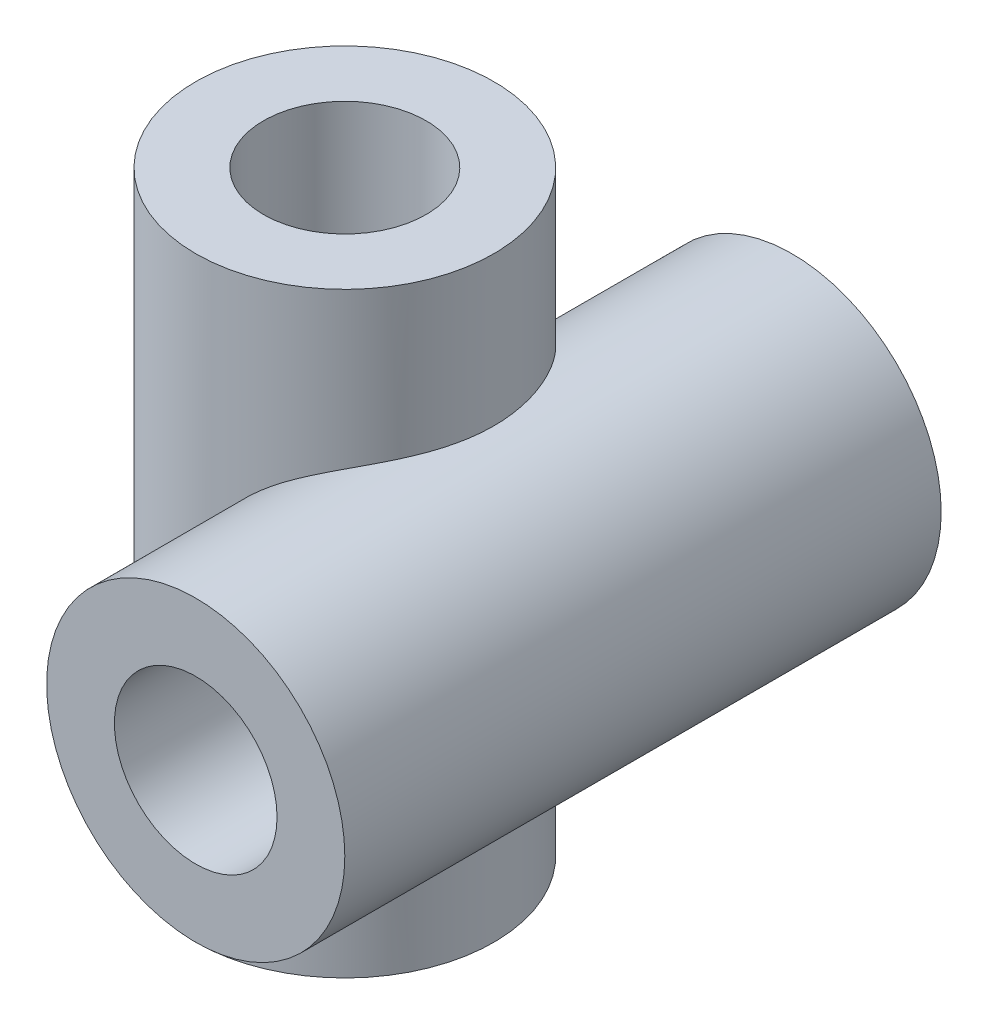
ISO-10303-21;
HEADER;
FILE_DESCRIPTION(('STEP AP214'),'2;1');
FILE_NAME('part.step','',(''),(''),'','','');
FILE_SCHEMA(('AUTOMOTIVE_DESIGN { 1 0 10303 214 1 1 1 1 }'));
ENDSEC;
DATA;
#1=APPLICATION_CONTEXT('core data for automotive mechanical design processes');
#2=APPLICATION_PROTOCOL_DEFINITION('international standard','automotive_design',2000,#1);
#3=PRODUCT_CONTEXT('',#1,'mechanical');
#4=PRODUCT('Part','Part','',(#3));
#5=PRODUCT_RELATED_PRODUCT_CATEGORY('part','',(#4));
#6=PRODUCT_DEFINITION_FORMATION('','',#4);
#7=PRODUCT_DEFINITION_CONTEXT('part definition',#1,'design');
#8=PRODUCT_DEFINITION('design','',#6,#7);
#9=PRODUCT_DEFINITION_SHAPE('','',#8);
#10=(LENGTH_UNIT() NAMED_UNIT(*) SI_UNIT(.MILLI.,.METRE.));
#11=(NAMED_UNIT(*) PLANE_ANGLE_UNIT() SI_UNIT($,.RADIAN.));
#12=(NAMED_UNIT(*) SI_UNIT($,.STERADIAN.) SOLID_ANGLE_UNIT());
#13=UNCERTAINTY_MEASURE_WITH_UNIT(LENGTH_MEASURE(1.E-05),#10,'distance_accuracy_value','');
#14=(GEOMETRIC_REPRESENTATION_CONTEXT(3) GLOBAL_UNCERTAINTY_ASSIGNED_CONTEXT((#13)) GLOBAL_UNIT_ASSIGNED_CONTEXT((#10,
#11,#12)) REPRESENTATION_CONTEXT('',''));
#15=CARTESIAN_POINT('',(0.,0.,0.));
#16=DIRECTION('',(0.,0.,1.));
#17=DIRECTION('',(1.,0.,0.));
#18=AXIS2_PLACEMENT_3D('',#15,#16,#17);
#19=CARTESIAN_POINT('',(0.,110.,0.));
#20=DIRECTION('',(0.,-1.,0.));
#21=DIRECTION('',(0.,0.,-1.));
#22=AXIS2_PLACEMENT_3D('',#19,#20,#21);
#23=CYLINDRICAL_SURFACE('',#22,27.5);
#24=CARTESIAN_POINT('',(0.,110.,0.));
#25=DIRECTION('',(0.,1.,0.));
#26=DIRECTION('',(0.,0.,1.));
#27=AXIS2_PLACEMENT_3D('',#24,#25,#26);
#28=CIRCLE('',#27,27.5);
#29=CARTESIAN_POINT('',(0.,110.,27.5));
#30=VERTEX_POINT('',#29);
#31=EDGE_CURVE('E48',#30,#30,#28,.T.);
#32=ORIENTED_EDGE('',*,*,#31,.F.);
#33=EDGE_LOOP('',(#32));
#34=FACE_BOUND('',#33,.T.);
#35=CARTESIAN_POINT('',(0.,0.,0.));
#36=DIRECTION('',(0.,1.,0.));
#37=DIRECTION('',(0.,0.,1.));
#38=AXIS2_PLACEMENT_3D('',#35,#36,#37);
#39=CIRCLE('',#38,27.5);
#40=CARTESIAN_POINT('',(0.,0.,27.5));
#41=VERTEX_POINT('',#40);
#42=EDGE_CURVE('E52',#41,#41,#39,.T.);
#43=ORIENTED_EDGE('',*,*,#42,.T.);
#44=EDGE_LOOP('',(#43));
#45=FACE_BOUND('',#44,.T.);
#46=CARTESIAN_POINT('',(0.,55.,-27.5));
#47=CARTESIAN_POINT('',(3.06945652374734E-06,55.765801615036,-27.5000046339053));
#48=CARTESIAN_POINT('',(0.0320109801255595,56.5316700645696,-27.5000571327644));
#49=CARTESIAN_POINT('',(0.159834732779299,58.0581255381757,-27.4996082774272));
#50=CARTESIAN_POINT('',(0.255658666485013,58.8187118801304,-27.4991068529894));
#51=CARTESIAN_POINT('',(0.510545462850665,60.3298063456024,-27.4955558992444));
#52=CARTESIAN_POINT('',(0.669655633353291,61.0803064946191,-27.4925044618639));
#53=CARTESIAN_POINT('',(1.04998801589813,62.5653384933435,-27.4806055622827));
#54=CARTESIAN_POINT('',(1.27120857583959,63.2998707672277,-27.4717582542405));
#55=CARTESIAN_POINT('',(1.77448794932213,64.7486846142558,-27.4438472935896));
#56=CARTESIAN_POINT('',(2.05662553836895,65.4629385981975,-27.4247703645971));
#57=CARTESIAN_POINT('',(2.67940308194664,66.8649180194967,-27.370941446767));
#58=CARTESIAN_POINT('',(3.02004435135857,67.5526428601812,-27.336189105593));
#59=CARTESIAN_POINT('',(3.7568402650003,68.8960081972105,-27.2447034753495));
#60=CARTESIAN_POINT('',(4.15298202384313,69.5516560932311,-27.1879752829688));
#61=CARTESIAN_POINT('',(4.99696445875971,70.8255161331857,-27.0455796385592));
#62=CARTESIAN_POINT('',(5.44480183581703,71.4437306621396,-26.9599140325338));
#63=CARTESIAN_POINT('',(6.36859342202774,72.6138390801518,-26.7564154932106));
#64=CARTESIAN_POINT('',(6.84276238928992,73.1673813194698,-26.63997201701));
#65=CARTESIAN_POINT('',(7.82814824598066,74.2300056349589,-26.3672386357279));
#66=CARTESIAN_POINT('',(8.33936427986415,74.7390887372472,-26.2109496506073));
#67=CARTESIAN_POINT('',(9.39062475182124,75.7077440614877,-25.8529292853272));
#68=CARTESIAN_POINT('',(9.93062857223945,76.1673834176404,-25.6512607022754));
#69=CARTESIAN_POINT('',(11.0310589411744,77.0343906567419,-25.1976100513211));
#70=CARTESIAN_POINT('',(11.5914819181775,77.4417676250812,-24.9456367480057));
#71=CARTESIAN_POINT('',(12.6454041794281,78.1503295598248,-24.4262244374316));
#72=CARTESIAN_POINT('',(13.137622246088,78.4584208475427,-24.1655662039173));
#73=CARTESIAN_POINT('',(14.1226073246045,79.0337378374341,-23.6034602022499));
#74=CARTESIAN_POINT('',(14.6153742757039,79.3009676822988,-23.3020165749265));
#75=CARTESIAN_POINT('',(15.5944311575141,79.7953280369232,-22.6584844633427));
#76=CARTESIAN_POINT('',(16.0807208674981,80.0224571833765,-22.3163945978905));
#77=CARTESIAN_POINT('',(17.0400937666223,80.4384311141616,-21.5927347259871));
#78=CARTESIAN_POINT('',(17.5131768789816,80.6272756759537,-21.2111644900647));
#79=CARTESIAN_POINT('',(18.4130828153488,80.9594788257355,-20.4338245865912));
#80=CARTESIAN_POINT('',(18.8409965363723,81.1048423631328,-20.0401671426008));
#81=CARTESIAN_POINT('',(19.6752402906139,81.3669172001216,-19.2217673574734));
#82=CARTESIAN_POINT('',(20.0815714709716,81.4836300237316,-18.7970266713091));
#83=CARTESIAN_POINT('',(20.8690008001652,81.6916798533522,-17.9187823310866));
#84=CARTESIAN_POINT('',(21.2500933143645,81.7830112072941,-17.4652722981028));
#85=CARTESIAN_POINT('',(21.983873779787,81.9437090505992,-16.5321406816002));
#86=CARTESIAN_POINT('',(22.3365597833339,82.0130740348049,-16.0525173114075));
#87=CARTESIAN_POINT('',(23.044392161134,82.139258088577,-15.0211479046047));
#88=CARTESIAN_POINT('',(23.3963274601708,82.1941560558108,-14.4669618268783));
#89=CARTESIAN_POINT('',(24.0601960681601,82.2860785503313,-13.3337283554725));
#90=CARTESIAN_POINT('',(24.3721273902903,82.3231021901305,-12.754679728884));
#91=CARTESIAN_POINT('',(24.9540499090664,82.383458074661,-11.5748955470939));
#92=CARTESIAN_POINT('',(25.2240228482474,82.4067843714272,-10.9741506904904));
#93=CARTESIAN_POINT('',(25.7202589310053,82.4434767921589,-9.75457705638748));
#94=CARTESIAN_POINT('',(25.9465198547766,82.4568424103948,-9.13574736233098));
#95=CARTESIAN_POINT('',(26.3795685784163,82.4781271529796,-7.80495023575133));
#96=CARTESIAN_POINT('',(26.580379022872,82.4851557163149,-7.09101619162883));
#97=CARTESIAN_POINT('',(26.9237017180356,82.4944971162596,-5.64920924137003));
#98=CARTESIAN_POINT('',(27.0662096775682,82.4968096058067,-4.92133531335729));
#99=CARTESIAN_POINT('',(27.2919941916128,82.4994457006674,-3.45635363514277));
#100=CARTESIAN_POINT('',(27.3752632079039,82.4997690529011,-2.71924472191916));
#101=CARTESIAN_POINT('',(27.4819943869217,82.5000457159617,-1.24071603232943));
#102=CARTESIAN_POINT('',(27.5054563195562,82.4999990253649,-0.499296239389311));
#103=CARTESIAN_POINT('',(27.4921463379164,82.5000009729852,1.01372744794338));
#104=CARTESIAN_POINT('',(27.4528407174906,82.5000536375411,1.78531029457764));
#105=CARTESIAN_POINT('',(27.3094703234095,82.4994327598342,3.32245726694052));
#106=CARTESIAN_POINT('',(27.2054030582899,82.4987591896313,4.08802115996473));
#107=CARTESIAN_POINT('',(26.9331955530215,82.494494829688,5.60796463190215));
#108=CARTESIAN_POINT('',(26.7650314171745,82.490902951419,6.36233993054129));
#109=CARTESIAN_POINT('',(26.3658398207065,82.4773274883535,7.85421807425848));
#110=CARTESIAN_POINT('',(26.1348126738056,82.4673439354546,8.59172100351881));
#111=CARTESIAN_POINT('',(25.6113484648269,82.4363219954081,10.0451995554434));
#112=CARTESIAN_POINT('',(25.3188518353887,82.4152728551614,10.7611535209278));
#113=CARTESIAN_POINT('',(24.6748887056358,82.3564111269378,12.1653792896541));
#114=CARTESIAN_POINT('',(24.3234210603949,82.3185982134676,12.8536505551128));
#115=CARTESIAN_POINT('',(23.5647026597078,82.2196563957926,14.1968135215591));
#116=CARTESIAN_POINT('',(23.1574657208792,82.1585332599279,14.8517134351963));
#117=CARTESIAN_POINT('',(22.2912803887344,82.0057866305694,16.1226546309061));
#118=CARTESIAN_POINT('',(21.8323360227876,81.9141655114066,16.7386989335287));
#119=CARTESIAN_POINT('',(20.8922865629657,81.6984797292444,17.8966598573305));
#120=CARTESIAN_POINT('',(20.4134280368609,81.5762608950915,18.440741115235));
#121=CARTESIAN_POINT('',(19.4201046153525,81.291293126675,19.484048619928));
#122=CARTESIAN_POINT('',(18.9056408764546,81.1285455083955,19.9832763224115));
#123=CARTESIAN_POINT('',(17.8494946471494,80.7571454012233,20.9320021641848));
#124=CARTESIAN_POINT('',(17.3078507350612,80.5485566303852,21.3815680414977));
#125=CARTESIAN_POINT('',(16.2058502117045,80.0808711099081,22.2284290802218));
#126=CARTESIAN_POINT('',(15.6454967778933,79.8217829008469,22.6257330612784));
#127=CARTESIAN_POINT('',(14.5940706986093,79.2896058105077,23.3152842107415));
#128=CARTESIAN_POINT('',(14.1040689232109,79.0233432184374,23.614465023563));
#129=CARTESIAN_POINT('',(13.124739202363,78.4504485188147,24.1724788846819));
#130=CARTESIAN_POINT('',(12.6354111925725,78.1438205816698,24.431316095115));
#131=CARTESIAN_POINT('',(11.6642809350898,77.490498702716,24.9095894754192));
#132=CARTESIAN_POINT('',(11.1824792721404,77.1438016652288,25.1290225976407));
#133=CARTESIAN_POINT('',(10.2329525376637,76.4116432238435,25.5304215411254));
#134=CARTESIAN_POINT('',(9.76522763050757,76.0261813675251,25.7123869250307));
#135=CARTESIAN_POINT('',(8.87325308613192,75.2393112948129,26.0332181842932));
#136=CARTESIAN_POINT('',(8.44800411749934,74.8397360707157,26.173816420323));
#137=CARTESIAN_POINT('',(7.61982903269455,74.0097991179937,26.426798955029));
#138=CARTESIAN_POINT('',(7.21690183650578,73.5794388811834,26.539184619673));
#139=CARTESIAN_POINT('',(6.43692255777729,72.6902973022409,26.73907623259));
#140=CARTESIAN_POINT('',(6.05987631533724,72.2315095895292,26.8265765793414));
#141=CARTESIAN_POINT('',(5.33473939476354,71.2881929888208,26.9801398492756));
#142=CARTESIAN_POINT('',(4.98665070592676,70.8036623361021,27.0462013005736));
#143=CARTESIAN_POINT('',(4.28750335018021,69.7602184910132,27.1662630694368));
#144=CARTESIAN_POINT('',(3.93985601325371,69.1987933416918,27.2183111531714));
#145=CARTESIAN_POINT('',(3.28537478496647,68.0513704693292,27.305042007942));
#146=CARTESIAN_POINT('',(2.97854303201487,67.4653714609287,27.3397238693902));
#147=CARTESIAN_POINT('',(2.40758545841615,66.2720200113471,27.3959100442461));
#148=CARTESIAN_POINT('',(2.14347818808986,65.6646584334524,27.4174086449275));
#149=CARTESIAN_POINT('',(1.65969747273177,64.4322362916296,27.4509415662146));
#150=CARTESIAN_POINT('',(1.4400262139876,63.8071748585783,27.4629754212312));
#151=CARTESIAN_POINT('',(1.02215847236132,62.4650271266702,27.4818902622311));
#152=CARTESIAN_POINT('',(0.829914999338307,61.7460686917925,27.4879566525628));
#153=CARTESIAN_POINT('',(0.504310849896867,60.294889941633,27.4958577058789));
#154=CARTESIAN_POINT('',(0.370954464856897,59.5626686638721,27.4976920604961));
#155=CARTESIAN_POINT('',(0.164003830785372,58.089731753207,27.4997062382365));
#156=CARTESIAN_POINT('',(0.0904166762173485,57.3490151225039,27.4998858649735));
#157=CARTESIAN_POINT('',(0.00351682035491619,55.8640614594207,27.5000339213509));
#158=CARTESIAN_POINT('',(-0.00979573322541881,55.1198244184177,27.5000023504737));
#159=CARTESIAN_POINT('',(0.0245881276643787,53.6043443898489,27.4999957052183));
#160=CARTESIAN_POINT('',(0.0746298383920898,52.8331535508344,27.5000228306384));
#161=CARTESIAN_POINT('',(0.239420685178864,51.2976957555875,27.4990805464554));
#162=CARTESIAN_POINT('',(0.354172204984111,50.5334290554769,27.4981111001402));
#163=CARTESIAN_POINT('',(0.647625671740654,49.0169696347344,27.492764515714));
#164=CARTESIAN_POINT('',(0.826352515217402,48.2647817339048,27.4883860501744));
#165=CARTESIAN_POINT('',(1.24646174653841,46.7781794605844,27.4725404435244));
#166=CARTESIAN_POINT('',(1.487843805845,46.0437649949193,27.4610733395832));
#167=CARTESIAN_POINT('',(2.03156516359669,44.5978066803361,27.4262089804885));
#168=CARTESIAN_POINT('',(2.33392734505939,43.8862715335275,27.4028072417644));
#169=CARTESIAN_POINT('',(2.99713686883354,42.4917721996146,27.3382171764268));
#170=CARTESIAN_POINT('',(3.35798534118435,41.8088085648738,27.2970285061187));
#171=CARTESIAN_POINT('',(4.13479870053091,40.4772160410362,27.1902010754909));
#172=CARTESIAN_POINT('',(4.55074556709499,39.8285760227433,27.1245702965266));
#173=CARTESIAN_POINT('',(5.43350935204082,38.5710648835682,26.9616077326081));
#174=CARTESIAN_POINT('',(5.90032194324698,37.9621903868481,26.864278642848));
#175=CARTESIAN_POINT('',(6.85253793391283,36.8216079399399,26.6367991140455));
#176=CARTESIAN_POINT('',(7.33556376019847,36.2875064392946,26.5087126473948));
#177=CARTESIAN_POINT('',(8.33570242227968,35.2644676513909,26.2114107998934));
#178=CARTESIAN_POINT('',(8.85281400632849,34.7755287071892,26.0421969287705));
#179=CARTESIAN_POINT('',(9.91261212535466,33.8474769905434,25.657501165029));
#180=CARTESIAN_POINT('',(10.4552632990579,33.4082980369358,25.4420818566546));
#181=CARTESIAN_POINT('',(11.5575447726841,32.5820988202205,24.9606589527066));
#182=CARTESIAN_POINT('',(12.1171722777962,32.1950700281206,24.6946636458747));
#183=CARTESIAN_POINT('',(13.1653093554983,31.5245074130006,24.1500263986057));
#184=CARTESIAN_POINT('',(13.6529644898869,31.2340623126161,23.878206834055));
#185=CARTESIAN_POINT('',(14.6264130832522,30.6929896068965,23.2946328526984));
#186=CARTESIAN_POINT('',(15.1122067309589,30.4423578548723,22.9828826009201));
#187=CARTESIAN_POINT('',(16.0752522582209,29.9797953722337,22.3199032053449));
#188=CARTESIAN_POINT('',(16.5525031916235,29.7678689048121,21.9686697195428));
#189=CARTESIAN_POINT('',(17.4920956857942,29.3806693282069,21.2281506180853));
#190=CARTESIAN_POINT('',(17.954436991365,29.2053968461217,20.8388643515672));
#191=CARTESIAN_POINT('',(18.8384665447179,28.8956428498105,20.0424635201279));
#192=CARTESIAN_POINT('',(19.2610483650125,28.7596969271144,19.6369054946924));
#193=CARTESIAN_POINT('',(20.0831522191668,28.5155845372684,18.7952929903179));
#194=CARTESIAN_POINT('',(20.4826752556447,28.4074168615868,18.3592398391624));
#195=CARTESIAN_POINT('',(21.2552042440976,28.2154704414145,17.4590434097532));
#196=CARTESIAN_POINT('',(21.6282040742014,28.1316973137539,16.99489369195));
#197=CARTESIAN_POINT('',(22.3446923633672,27.9850679370873,16.0412135076258));
#198=CARTESIAN_POINT('',(22.6881787946197,27.9222131244878,15.5516813008216));
#199=CARTESIAN_POINT('',(23.3784892778146,27.8081188645177,14.4960510197894));
#200=CARTESIAN_POINT('',(23.7217053285705,27.7588535011569,13.9273782062098));
#201=CARTESIAN_POINT('',(24.3665102925471,27.6771727000169,12.7657579600111));
#202=CARTESIAN_POINT('',(24.6680969175232,27.6447581882077,12.1728091953368));
#203=CARTESIAN_POINT('',(25.2277945545173,27.5925896099764,10.9659032641916));
#204=CARTESIAN_POINT('',(25.4858868172696,27.5728409932457,10.3519371742182));
#205=CARTESIAN_POINT('',(25.9569098157348,27.5423131546853,9.10670292684442));
#206=CARTESIAN_POINT('',(26.1698384041968,27.5315343592433,8.47543394841017));
#207=CARTESIAN_POINT('',(26.5721885094628,27.5148296146344,7.12216201857758));
#208=CARTESIAN_POINT('',(26.7556949737714,27.5096440154457,6.39838416074713));
#209=CARTESIAN_POINT('',(27.0632649938524,27.5030379515526,4.93826208122491));
#210=CARTESIAN_POINT('',(27.1873242670213,27.5016177580765,4.20191695813762));
#211=CARTESIAN_POINT('',(27.3751763203319,27.5001223215344,2.72148752632602));
#212=CARTESIAN_POINT('',(27.4389623538197,27.5000472290148,1.97740236064628));
#213=CARTESIAN_POINT('',(27.5058199596248,27.49998048907,0.486516576386014));
#214=CARTESIAN_POINT('',(27.508891460564,27.4999888417429,-0.260284045385868));
#215=CARTESIAN_POINT('',(27.4533410034818,27.5000240837882,-1.77777413042812));
#216=CARTESIAN_POINT('',(27.3925570621701,27.5000516114084,-2.54838535380264));
#217=CARTESIAN_POINT('',(27.2063524868556,27.5014108947183,-4.081778751217));
#218=CARTESIAN_POINT('',(27.0809295746373,27.502742696379,-4.84456064834392));
#219=CARTESIAN_POINT('',(26.7662750162337,27.509339878724,-6.35716055131536));
#220=CARTESIAN_POINT('',(26.5770175719438,27.5146068508166,-7.10697318675523));
#221=CARTESIAN_POINT('',(26.1360755241244,27.5329586551368,-8.58792459072175));
#222=CARTESIAN_POINT('',(25.8843912705326,27.5460434435417,-9.31906346390011));
#223=CARTESIAN_POINT('',(25.3205620091799,27.5850434961566,-10.7571104663477));
#224=CARTESIAN_POINT('',(25.0084321835213,27.6109555410851,-11.4640246277675));
#225=CARTESIAN_POINT('',(24.3262026092831,27.6816076968536,-12.8483962689304));
#226=CARTESIAN_POINT('',(23.9561017491947,27.7263481687285,-13.5258531835564));
#227=CARTESIAN_POINT('',(23.1614900671955,27.8414220284086,-14.8454799112791));
#228=CARTESIAN_POINT('',(22.7370015402202,27.9117449509001,-15.4876640303657));
#229=CARTESIAN_POINT('',(21.8380406329801,28.0852898118926,-16.7313616423355));
#230=CARTESIAN_POINT('',(21.3635728756871,28.1885087093723,-17.3328788883817));
#231=CARTESIAN_POINT('',(20.3997768447606,28.4280481423148,-18.4557311866655));
#232=CARTESIAN_POINT('',(19.9129494704926,28.5620739784888,-18.9796994350126));
#233=CARTESIAN_POINT('',(18.9067556364867,28.8717956975333,-19.9822113936609));
#234=CARTESIAN_POINT('',(18.3873905087414,29.0474898754528,-20.4607569614085));
#235=CARTESIAN_POINT('',(17.3247362409728,29.4454431693927,-21.3679891807188));
#236=CARTESIAN_POINT('',(16.7814790478261,29.6676415137297,-21.796739778449));
#237=CARTESIAN_POINT('',(15.6797118447226,30.1626257353445,-22.6022589257618));
#238=CARTESIAN_POINT('',(15.1212042556884,30.4354036227328,-22.9790356691177));
#239=CARTESIAN_POINT('',(14.0768383147183,30.9923134509486,-23.6308620831854));
#240=CARTESIAN_POINT('',(13.5916186250697,31.2696539806517,-23.9127739324044));
#241=CARTESIAN_POINT('',(12.6241935807865,31.8638277673393,-24.4373159373596));
#242=CARTESIAN_POINT('',(12.1419879153157,32.180656878871,-24.6799502102604));
#243=CARTESIAN_POINT('',(11.1871107587227,32.8532001998931,-25.1272094667072));
#244=CARTESIAN_POINT('',(10.7144403841513,33.2089189322803,-25.3318300217388));
#245=CARTESIAN_POINT('',(9.78480749353428,33.9577050275418,-25.7052235422579));
#246=CARTESIAN_POINT('',(9.32784532076895,34.3507732059293,-25.8739957247473));
#247=CARTESIAN_POINT('',(8.45177094396591,35.1567146435449,-26.1729595021374));
#248=CARTESIAN_POINT('',(8.03188261191024,35.5683011077419,-26.3043559731812));
#249=CARTESIAN_POINT('',(7.21589831748844,36.4216860145717,-26.5398033704751));
#250=CARTESIAN_POINT('',(6.81980147097915,36.8634833331972,-26.6438553133926));
#251=CARTESIAN_POINT('',(6.05472736808988,37.7748894484233,-26.828067292978));
#252=CARTESIAN_POINT('',(5.68575925490211,38.2445075260309,-26.9082193022123));
#253=CARTESIAN_POINT('',(4.97790047077085,39.2087732677397,-27.0481182427321));
#254=CARTESIAN_POINT('',(4.63901170354825,39.7034225129564,-27.1078638831797));
#255=CARTESIAN_POINT('',(3.95761339348704,40.7714820778039,-27.2161582164267));
#256=CARTESIAN_POINT('',(3.61891119938399,41.3475255678411,-27.2627163872999));
#257=CARTESIAN_POINT('',(2.98395975138636,42.5236034307432,-27.3395005569363));
#258=CARTESIAN_POINT('',(2.68771389621777,43.1236397193737,-27.3697252487035));
#259=CARTESIAN_POINT('',(2.13960328840489,44.344118956063,-27.4180198116659));
#260=CARTESIAN_POINT('',(1.88773951415224,44.9645623536336,-27.43608941493));
#261=CARTESIAN_POINT('',(1.42990454926327,46.2223016811768,-27.463757924273));
#262=CARTESIAN_POINT('',(1.22393134235775,46.8595968693644,-27.4733572025629));
#263=CARTESIAN_POINT('',(0.869007661686304,48.1122883259609,-27.4868075449284));
#264=CARTESIAN_POINT('',(0.717553150805295,48.7269739779766,-27.4909444757186));
#265=CARTESIAN_POINT('',(0.457401535674271,49.965307551913,-27.4965039237694));
#266=CARTESIAN_POINT('',(0.348702108696382,50.5889549850642,-27.4979265885024));
#267=CARTESIAN_POINT('',(0.174568250318495,51.842298247981,-27.4995841580872));
#268=CARTESIAN_POINT('',(0.109135975544317,52.4719943776533,-27.4998190037367));
#269=CARTESIAN_POINT('',(0.0218482037603956,53.7344449089019,-27.5000250245295));
#270=CARTESIAN_POINT('',(-2.53636603138578E-06,54.3671996367662,-27.4999961708922));
#271=CARTESIAN_POINT('',(0.,55.,-27.5));
#272=B_SPLINE_CURVE_WITH_KNOTS('',3,(#46,#47,#48,#49,#50,#51,#52,#53,#54,#55,#56,#57,#58,#59,
#60,#61,#62,#63,#64,#65,#66,#67,#68,#69,#70,#71,#72,#73,#74,#75,#76,#77,#78,#79,#80,#81,#82,#83,
#84,#85,#86,#87,#88,#89,#90,#91,#92,#93,#94,#95,#96,#97,#98,#99,#100,#101,#102,#103,#104,#105,
#106,#107,#108,#109,#110,#111,#112,#113,#114,#115,#116,#117,#118,#119,#120,#121,#122,#123,#124,
#125,#126,#127,#128,#129,#130,#131,#132,#133,#134,#135,#136,#137,#138,#139,#140,#141,#142,#143,
#144,#145,#146,#147,#148,#149,#150,#151,#152,#153,#154,#155,#156,#157,#158,#159,#160,#161,#162,
#163,#164,#165,#166,#167,#168,#169,#170,#171,#172,#173,#174,#175,#176,#177,#178,#179,#180,#181,
#182,#183,#184,#185,#186,#187,#188,#189,#190,#191,#192,#193,#194,#195,#196,#197,#198,#199,#200,
#201,#202,#203,#204,#205,#206,#207,#208,#209,#210,#211,#212,#213,#214,#215,#216,#217,#218,#219,
#220,#221,#222,#223,#224,#225,#226,#227,#228,#229,#230,#231,#232,#233,#234,#235,#236,#237,#238,
#239,#240,#241,#242,#243,#244,#245,#246,#247,#248,#249,#250,#251,#252,#253,#254,#255,#256,#257,
#258,#259,#260,#261,#262,#263,#264,#265,#266,#267,#268,#269,#270,#271),.UNSPECIFIED.,.T.,.F.,(4,
2,2,2,2,2,2,2,2,2,2,2,2,2,2,2,2,2,2,2,2,2,2,2,2,2,2,2,2,2,2,2,2,2,2,2,2,2,2,2,2,2,2,2,2,2,2,2,2,
2,2,2,2,2,2,2,2,2,2,2,2,2,2,2,2,2,2,2,2,2,2,2,2,2,2,2,2,2,2,2,2,2,2,2,2,2,2,2,2,2,2,2,2,2,2,2,2,
2,2,2,2,2,2,2,2,2,2,2,2,2,2,2,4),(0.,2.29685311850716,4.59399752802923,6.89286234005832,
9.19166600939343,11.4934603984964,13.7953065276266,16.0966191267145,18.3977849459489,
20.6089308868009,22.8200257808981,25.0280795359539,27.235748917203,29.1427303367109,
31.049518290684,32.9563710573911,34.8632349078941,36.6593358914834,38.4553413142981,
40.2517463604194,42.0482744713688,44.022604895355,45.9970333377501,47.9723185275652,
49.9477040009517,52.1702175158565,54.3928945826199,56.6158544369199,58.8388228434654,
61.1538154232529,63.4688970693131,65.7848426372151,68.1007766475176,70.4189653621564,
72.7371990897987,75.0548595199173,77.3723395575712,79.5742465289125,81.7760820128597,
83.9748761424887,86.1732987293003,88.069365745097,89.9652370193398,91.8612548637739,
93.7572948390073,95.5560499279941,97.3547179098734,99.1537904402467,100.952986459611,
102.938136285893,104.92339007717,106.909503535293,108.895714688045,111.125919457595,
113.356286725821,115.586918694591,117.817556129934,120.133235874699,122.449000928839,
124.765668163594,127.082323250964,129.399849294727,131.717420121771,134.034234829064,
136.350852597285,138.541955756773,140.732978496168,142.921052075823,145.108767367568,
146.994285078912,148.879606278542,150.765135011766,152.650696001121,154.452626651427,
156.254478892932,158.056745682392,159.859136203319,161.855216730708,163.851406932994,
165.848455450909,167.845598894752,170.083149109807,172.320860494802,174.558822327202,
176.796786790621,179.113042040083,181.429378932078,183.746653072982,186.063914224541,
188.380594103197,190.69731840619,193.01309604332,195.328659663761,197.50850596222,
199.688263082904,201.865189284932,204.041771897361,205.917239045273,207.792509474991,
209.667998232773,211.543527950665,213.349054848133,215.154514606743,216.96058009611,
218.766759809922,220.774276223958,222.781953254565,224.789674538363,226.797307592588,
228.695054184398,230.592697664309,232.490435724017,234.388380908708),.UNSPECIFIED.);
#273=CARTESIAN_POINT('',(0.,55.,-27.5));
#274=VERTEX_POINT('',#273);
#275=EDGE_CURVE('E10',#274,#274,#272,.T.);
#276=ORIENTED_EDGE('',*,*,#275,.F.);
#277=EDGE_LOOP('',(#276));
#278=FACE_BOUND('',#277,.T.);
#279=ADVANCED_FACE('F35',(#34,#45,#278),#23,.T.);
#280=CARTESIAN_POINT('',(0.,110.,0.));
#281=DIRECTION('',(0.,1.,0.));
#282=DIRECTION('',(0.,0.,1.));
#283=AXIS2_PLACEMENT_3D('',#280,#281,#282);
#284=PLANE('',#283);
#285=CARTESIAN_POINT('',(0.,110.,0.));
#286=DIRECTION('',(0.,1.,0.));
#287=DIRECTION('',(0.,0.,1.));
#288=AXIS2_PLACEMENT_3D('',#285,#286,#287);
#289=CIRCLE('',#288,15.);
#290=CARTESIAN_POINT('',(0.,110.,15.));
#291=VERTEX_POINT('',#290);
#292=EDGE_CURVE('E97',#291,#291,#289,.T.);
#293=ORIENTED_EDGE('',*,*,#292,.F.);
#294=EDGE_LOOP('',(#293));
#295=FACE_BOUND('',#294,.T.);
#296=ORIENTED_EDGE('',*,*,#31,.T.);
#297=EDGE_LOOP('',(#296));
#298=FACE_BOUND('',#297,.T.);
#299=ADVANCED_FACE('F69',(#295,#298),#284,.T.);
#300=CARTESIAN_POINT('',(0.,0.,0.));
#301=DIRECTION('',(0.,1.,0.));
#302=DIRECTION('',(0.,0.,1.));
#303=AXIS2_PLACEMENT_3D('',#300,#301,#302);
#304=PLANE('',#303);
#305=CARTESIAN_POINT('',(0.,0.,0.));
#306=DIRECTION('',(0.,1.,0.));
#307=DIRECTION('',(0.,0.,1.));
#308=AXIS2_PLACEMENT_3D('',#305,#306,#307);
#309=CIRCLE('',#308,15.);
#310=CARTESIAN_POINT('',(0.,0.,15.));
#311=VERTEX_POINT('',#310);
#312=EDGE_CURVE('E94',#311,#311,#309,.T.);
#313=ORIENTED_EDGE('',*,*,#312,.T.);
#314=EDGE_LOOP('',(#313));
#315=FACE_BOUND('',#314,.T.);
#316=ORIENTED_EDGE('',*,*,#42,.F.);
#317=EDGE_LOOP('',(#316));
#318=FACE_BOUND('',#317,.T.);
#319=ADVANCED_FACE('F65',(#315,#318),#304,.F.);
#320=CARTESIAN_POINT('',(27.5,55.,55.));
#321=DIRECTION('',(0.,0.,-1.));
#322=DIRECTION('',(-1.,0.,0.));
#323=AXIS2_PLACEMENT_3D('',#320,#321,#322);
#324=CYLINDRICAL_SURFACE('',#323,27.5);
#325=CARTESIAN_POINT('',(27.5,55.,-55.));
#326=DIRECTION('',(0.,0.,1.));
#327=DIRECTION('',(1.,0.,0.));
#328=AXIS2_PLACEMENT_3D('',#325,#326,#327);
#329=CIRCLE('',#328,27.5);
#330=CARTESIAN_POINT('',(55.,55.,-55.));
#331=VERTEX_POINT('',#330);
#332=EDGE_CURVE('E89',#331,#331,#329,.T.);
#333=ORIENTED_EDGE('',*,*,#332,.T.);
#334=EDGE_LOOP('',(#333));
#335=FACE_BOUND('',#334,.T.);
#336=CARTESIAN_POINT('',(27.5,55.,55.));
#337=DIRECTION('',(0.,0.,1.));
#338=DIRECTION('',(1.,0.,0.));
#339=AXIS2_PLACEMENT_3D('',#336,#337,#338);
#340=CIRCLE('',#339,27.5);
#341=CARTESIAN_POINT('',(55.,55.,55.));
#342=VERTEX_POINT('',#341);
#343=EDGE_CURVE('E87',#342,#342,#340,.T.);
#344=ORIENTED_EDGE('',*,*,#343,.F.);
#345=EDGE_LOOP('',(#344));
#346=FACE_BOUND('',#345,.T.);
#347=ORIENTED_EDGE('',*,*,#275,.T.);
#348=EDGE_LOOP('',(#347));
#349=FACE_BOUND('',#348,.T.);
#350=ADVANCED_FACE('F59',(#335,#346,#349),#324,.T.);
#351=CARTESIAN_POINT('',(27.5,55.,55.));
#352=DIRECTION('',(0.,0.,1.));
#353=DIRECTION('',(1.,0.,0.));
#354=AXIS2_PLACEMENT_3D('',#351,#352,#353);
#355=PLANE('',#354);
#356=CARTESIAN_POINT('',(27.5,55.,55.));
#357=DIRECTION('',(0.,0.,1.));
#358=DIRECTION('',(1.,0.,0.));
#359=AXIS2_PLACEMENT_3D('',#356,#357,#358);
#360=CIRCLE('',#359,15.);
#361=CARTESIAN_POINT('',(42.5,55.,55.));
#362=VERTEX_POINT('',#361);
#363=EDGE_CURVE('E101',#362,#362,#360,.T.);
#364=ORIENTED_EDGE('',*,*,#363,.F.);
#365=EDGE_LOOP('',(#364));
#366=FACE_BOUND('',#365,.T.);
#367=ORIENTED_EDGE('',*,*,#343,.T.);
#368=EDGE_LOOP('',(#367));
#369=FACE_BOUND('',#368,.T.);
#370=ADVANCED_FACE('F64',(#366,#369),#355,.T.);
#371=CARTESIAN_POINT('',(27.5,55.,-55.));
#372=DIRECTION('',(0.,0.,1.));
#373=DIRECTION('',(1.,0.,0.));
#374=AXIS2_PLACEMENT_3D('',#371,#372,#373);
#375=PLANE('',#374);
#376=CARTESIAN_POINT('',(27.5,55.,-55.));
#377=DIRECTION('',(0.,0.,1.));
#378=DIRECTION('',(1.,0.,0.));
#379=AXIS2_PLACEMENT_3D('',#376,#377,#378);
#380=CIRCLE('',#379,15.);
#381=CARTESIAN_POINT('',(42.5,55.,-55.));
#382=VERTEX_POINT('',#381);
#383=EDGE_CURVE('E104',#382,#382,#380,.T.);
#384=ORIENTED_EDGE('',*,*,#383,.T.);
#385=EDGE_LOOP('',(#384));
#386=FACE_BOUND('',#385,.T.);
#387=ORIENTED_EDGE('',*,*,#332,.F.);
#388=EDGE_LOOP('',(#387));
#389=FACE_BOUND('',#388,.T.);
#390=ADVANCED_FACE('F67',(#386,#389),#375,.F.);
#391=CARTESIAN_POINT('',(0.,0.,0.));
#392=DIRECTION('',(0.,1.,0.));
#393=DIRECTION('',(0.,0.,1.));
#394=AXIS2_PLACEMENT_3D('',#391,#392,#393);
#395=CYLINDRICAL_SURFACE('',#394,15.);
#396=CARTESIAN_POINT('',(15.,46.7084380241115,0.));
#397=CARTESIAN_POINT('',(15.0000065407334,46.7084379198596,-0.228923310591934));
#398=CARTESIAN_POINT('',(14.994753723149,46.7163334380464,-0.457779248202807));
#399=CARTESIAN_POINT('',(14.9738676145845,46.7479451601722,-0.913984251942122));
#400=CARTESIAN_POINT('',(14.958233095948,46.7716632351611,-1.14133313664697));
#401=CARTESIAN_POINT('',(14.9168990313459,46.8350145156204,-1.59298220877853));
#402=CARTESIAN_POINT('',(14.8911946622943,46.8746553477333,-1.81728088192024));
#403=CARTESIAN_POINT('',(14.8302879972063,46.9699566635343,-2.26113407018833));
#404=CARTESIAN_POINT('',(14.7950860192765,47.025616610693,-2.48068874394108));
#405=CARTESIAN_POINT('',(14.7159386501664,47.1531275417417,-2.91369936028192));
#406=CARTESIAN_POINT('',(14.671983836017,47.2249959862312,-3.1271484441168));
#407=CARTESIAN_POINT('',(14.5763935718407,47.3849444338316,-3.54611305290006));
#408=CARTESIAN_POINT('',(14.5247580719079,47.4730245422798,-3.75162852628825));
#409=CARTESIAN_POINT('',(14.4150973339694,47.6653179545921,-4.15310227811182));
#410=CARTESIAN_POINT('',(14.3570743055617,47.7695256845596,-4.34906382784139));
#411=CARTESIAN_POINT('',(14.2361089424934,47.9939006745011,-4.73002598027));
#412=CARTESIAN_POINT('',(14.1731667265834,48.1140675492654,-4.91502684737379));
#413=CARTESIAN_POINT('',(14.0453122463945,48.3674214370995,-5.26915001647918));
#414=CARTESIAN_POINT('',(13.9804641932832,48.5003014381239,-5.43851519463454));
#415=CARTESIAN_POINT('',(13.8492916389366,48.7805070834105,-5.76437239450896));
#416=CARTESIAN_POINT('',(13.7829664885575,48.9278391798267,-5.92085860853808));
#417=CARTESIAN_POINT('',(13.650612494038,49.236095921214,-6.21992984215804));
#418=CARTESIAN_POINT('',(13.5845836318819,49.3970197276147,-6.36251571819313));
#419=CARTESIAN_POINT('',(13.4545758478598,49.7313935704063,-6.63301638449986));
#420=CARTESIAN_POINT('',(13.3905960016411,49.9048378402916,-6.76093785932743));
#421=CARTESIAN_POINT('',(13.2675587497071,50.2595217319729,-6.99925081500293));
#422=CARTESIAN_POINT('',(13.2084280815808,50.4405335237675,-7.1099438634547));
#423=CARTESIAN_POINT('',(13.0951151790555,50.8122743206746,-7.31654607477834));
#424=CARTESIAN_POINT('',(13.0409328706743,51.003003180442,-7.41245545869355));
#425=CARTESIAN_POINT('',(12.9387744940414,51.3928785036199,-7.5893712715978));
#426=CARTESIAN_POINT('',(12.8907992788991,51.592026119133,-7.67037565267241));
#427=CARTESIAN_POINT('',(12.8021417431399,51.9973347502956,-7.81745123296672));
#428=CARTESIAN_POINT('',(12.7614595900868,52.2034959269576,-7.88352208908668));
#429=CARTESIAN_POINT('',(12.6875220251983,52.6256887563603,-8.00198504685437));
#430=CARTESIAN_POINT('',(12.6544351472844,52.8418359865083,-8.05407042905473));
#431=CARTESIAN_POINT('',(12.5974908715449,53.2784611368703,-8.14285002948989));
#432=CARTESIAN_POINT('',(12.5736335787337,53.4989391063298,-8.17954407260181));
#433=CARTESIAN_POINT('',(12.5356463140877,53.9427701600884,-8.23764397195304));
#434=CARTESIAN_POINT('',(12.5215181822638,54.1661237801079,-8.25904693632199));
#435=CARTESIAN_POINT('',(12.5032864897674,54.6141774659963,-8.28662171522478));
#436=CARTESIAN_POINT('',(12.4991831191124,54.8388775573064,-8.29279324104962));
#437=CARTESIAN_POINT('',(12.5011153173859,55.2951161210828,-8.28988080064199));
#438=CARTESIAN_POINT('',(12.507469498979,55.5266503991226,-8.28031743834563));
#439=CARTESIAN_POINT('',(12.5307882853367,55.9879463792288,-8.24498580021897));
#440=CARTESIAN_POINT('',(12.5477531233269,56.2177080422202,-8.21921716819168));
#441=CARTESIAN_POINT('',(12.5919212659679,56.6738234597549,-8.15138977284896));
#442=CARTESIAN_POINT('',(12.6191246672216,56.9001771821228,-8.10933085583159));
#443=CARTESIAN_POINT('',(12.6831572105514,57.3478268589266,-8.00881208244251));
#444=CARTESIAN_POINT('',(12.7199862491559,57.569122867703,-7.95035240237172));
#445=CARTESIAN_POINT('',(12.8024203729958,58.0050576686806,-7.81691623274223));
#446=CARTESIAN_POINT('',(12.8480273177229,58.2196950391241,-7.74193624307032));
#447=CARTESIAN_POINT('',(12.9469051480134,58.6406278628359,-7.57542185453692));
#448=CARTESIAN_POINT('',(13.0001760472116,58.8469233012624,-7.48388742622372));
#449=CARTESIAN_POINT('',(13.1130178019675,59.2495222402311,-7.2843591521932));
#450=CARTESIAN_POINT('',(13.172586890112,59.4458285211707,-7.17636992033047));
#451=CARTESIAN_POINT('',(13.2964712514173,59.8270004252415,-6.94414569016177));
#452=CARTESIAN_POINT('',(13.360786372084,60.0118664156085,-6.81991121373048));
#453=CARTESIAN_POINT('',(13.4903647908819,60.3632164080278,-6.55976378467201));
#454=CARTESIAN_POINT('',(13.5555358822163,60.5300939952748,-6.42433620090409));
#455=CARTESIAN_POINT('',(13.6870048417444,60.8507431686222,-6.13926101171756));
#456=CARTESIAN_POINT('',(13.7533026876505,61.004515013598,-5.9896136873024));
#457=CARTESIAN_POINT('',(13.8852854386887,61.2980513966426,-5.67693877622051));
#458=CARTESIAN_POINT('',(13.9509703933494,61.4378170756201,-5.51391228136003));
#459=CARTESIAN_POINT('',(14.0800220412595,61.7026787651653,-5.17549664209181));
#460=CARTESIAN_POINT('',(14.1433887437924,61.8277748344827,-5.00010754719906));
#461=CARTESIAN_POINT('',(14.2650123281283,62.0605970091315,-4.64161231015491));
#462=CARTESIAN_POINT('',(14.3233434474737,62.1686081070517,-4.45871624755507));
#463=CARTESIAN_POINT('',(14.43481211862,62.3698099880742,-4.08344322395577));
#464=CARTESIAN_POINT('',(14.4879497462605,62.4630009876042,-3.89106640146392));
#465=CARTESIAN_POINT('',(14.5878065234657,62.6344685690929,-3.49814176612522));
#466=CARTESIAN_POINT('',(14.6345247190246,62.7127429349254,-3.29759274451959));
#467=CARTESIAN_POINT('',(14.7204910427744,62.8543628790595,-2.88973702078643));
#468=CARTESIAN_POINT('',(14.7597389940639,62.9177081038354,-2.68243015876393));
#469=CARTESIAN_POINT('',(14.8306905128154,63.0307629733481,-2.25786368327081));
#470=CARTESIAN_POINT('',(14.8622097325474,63.0801430828701,-2.04048550275897));
#471=CARTESIAN_POINT('',(14.9158828175986,63.163482885238,-1.60165728343431));
#472=CARTESIAN_POINT('',(14.9380365664305,63.1974423862837,-1.38020719401107));
#473=CARTESIAN_POINT('',(14.9725170996972,63.2500401773078,-0.934696559665665));
#474=CARTESIAN_POINT('',(14.9848420433427,63.2686755973339,-0.710635533722608));
#475=CARTESIAN_POINT('',(14.9994050599477,63.2906754470413,-0.261437328230108));
#476=CARTESIAN_POINT('',(15.0016429508502,63.294039601098,-0.0363001293306814));
#477=CARTESIAN_POINT('',(14.9958990062217,63.2853781239258,0.420386969074625));
#478=CARTESIAN_POINT('',(14.9876051285852,63.2728825969614,0.651924246681921));
#479=CARTESIAN_POINT('',(14.9604381878113,63.2316460640829,1.11292745228246));
#480=CARTESIAN_POINT('',(14.9415648952868,63.20290470592,1.34239333525326));
#481=CARTESIAN_POINT('',(14.893655690641,63.1290846728188,1.79760867010631));
#482=CARTESIAN_POINT('',(14.864619844033,63.0840061031987,2.02335814593665));
#483=CARTESIAN_POINT('',(14.797044432544,62.977399276411,2.46948865132569));
#484=CARTESIAN_POINT('',(14.7585049850542,62.9158712224314,2.6898697471592));
#485=CARTESIAN_POINT('',(14.672897272943,62.7763819472541,3.12326720744667));
#486=CARTESIAN_POINT('',(14.6258427536532,62.6984471777188,3.33629479172887));
#487=CARTESIAN_POINT('',(14.5243126250403,62.5260571838916,3.75372928426013));
#488=CARTESIAN_POINT('',(14.4698370125481,62.4316019525455,3.95813618882807));
#489=CARTESIAN_POINT('',(14.3548670382454,62.2262929160045,4.35669612369528));
#490=CARTESIAN_POINT('',(14.2943743812679,62.1154437514586,4.55085203471771));
#491=CARTESIAN_POINT('',(14.1689546789267,61.8775936399868,4.9274863646047));
#492=CARTESIAN_POINT('',(14.1040277749623,61.7505932079818,5.1099651554706));
#493=CARTESIAN_POINT('',(13.9736128057181,61.4852137848313,5.45630828342393));
#494=CARTESIAN_POINT('',(13.9082082818824,61.3473252249922,5.62058008978785));
#495=CARTESIAN_POINT('',(13.7765927658812,61.0575087608597,5.93588091514215));
#496=CARTESIAN_POINT('',(13.7103817883255,60.9055811105732,6.08691017363134));
#497=CARTESIAN_POINT('',(13.5788847207848,60.5885586744691,6.37486872801334));
#498=CARTESIAN_POINT('',(13.5135985689831,60.4234647736414,6.511798970178));
#499=CARTESIAN_POINT('',(13.3856380014035,60.0811577647719,6.77093689011058));
#500=CARTESIAN_POINT('',(13.3229635798285,59.9039446836332,6.893144600559));
#501=CARTESIAN_POINT('',(13.2028704207455,59.5417888402603,7.1204250845947));
#502=CARTESIAN_POINT('',(13.1453794646422,59.3570330781144,7.22575793903435));
#503=CARTESIAN_POINT('',(13.035831638985,58.9782777467203,7.42156895529309));
#504=CARTESIAN_POINT('',(12.9837746957908,58.7842783027918,7.51204731842574));
#505=CARTESIAN_POINT('',(12.8862869082699,58.3883564327418,7.67807817822857));
#506=CARTESIAN_POINT('',(12.8408570781034,58.1864327999534,7.75362839104034));
#507=CARTESIAN_POINT('',(12.7576395308247,57.7760833086124,7.88980382072045));
#508=CARTESIAN_POINT('',(12.7198519983105,57.5676572931363,7.95042867707756));
#509=CARTESIAN_POINT('',(12.6519416749782,57.1407834920042,8.05807182195272));
#510=CARTESIAN_POINT('',(12.6220187173697,56.9222153288113,8.10473889179316));
#511=CARTESIAN_POINT('',(12.5716681266078,56.4812675997793,8.18262256451234));
#512=CARTESIAN_POINT('',(12.5512406215828,56.2588879825517,8.21383895890526));
#513=CARTESIAN_POINT('',(12.5203061153047,55.8117846812265,8.26091579606459));
#514=CARTESIAN_POINT('',(12.5098009523021,55.587060570573,8.27677339341617));
#515=CARTESIAN_POINT('',(12.4989334241735,55.1368084088141,8.2931754564434));
#516=CARTESIAN_POINT('',(12.4985712322742,54.9112803440442,8.29371966058936));
#517=CARTESIAN_POINT('',(12.5081377197424,54.4542624188554,8.27928573062641));
#518=CARTESIAN_POINT('',(12.5183706557955,54.22279320849,8.26384866975501));
#519=CARTESIAN_POINT('',(12.5493749463861,53.7622262297258,8.21668925910852));
#520=CARTESIAN_POINT('',(12.5701465255781,53.533128511987,8.18496656216908));
#521=CARTESIAN_POINT('',(12.621766572309,53.0789583779496,8.1051382411074));
#522=CARTESIAN_POINT('',(12.652614843351,52.8538858832489,8.05703293644751));
#523=CARTESIAN_POINT('',(12.7236829415227,52.4094204313248,7.94432671623903));
#524=CARTESIAN_POINT('',(12.7639026379419,52.1900273949331,7.87972603076286));
#525=CARTESIAN_POINT('',(12.8526081191936,51.7593064870867,7.73419009406221));
#526=CARTESIAN_POINT('',(12.9010653233004,51.5479537217224,7.65331114891946));
#527=CARTESIAN_POINT('',(13.0051501099718,51.1341436016268,7.47507283376075));
#528=CARTESIAN_POINT('',(13.0607776864566,50.9316862393532,7.37771347771887));
#529=CARTESIAN_POINT('',(13.1777627673516,50.5372854068068,7.16666670366596));
#530=CARTESIAN_POINT('',(13.2391185231438,50.3453387561742,7.05298426287327));
#531=CARTESIAN_POINT('',(13.3659479495456,49.9733519325419,6.80957098461894));
#532=CARTESIAN_POINT('',(13.4314214886359,49.7933113796456,6.67984065958855));
#533=CARTESIAN_POINT('',(13.5625465125417,49.4520520866423,6.40930433127952));
#534=CARTESIAN_POINT('',(13.6281237204383,49.2904128760113,6.26899239561449));
#535=CARTESIAN_POINT('',(13.7597658196252,48.9805054906488,5.97451635625917));
#536=CARTESIAN_POINT('',(13.8258307029471,48.8322370979611,5.82035247844968));
#537=CARTESIAN_POINT('',(13.9567347216082,48.5498686588352,5.49905821422726));
#538=CARTESIAN_POINT('',(14.0215737853964,48.415769437368,5.33192707380345));
#539=CARTESIAN_POINT('',(14.1483512641827,48.1623425375169,4.98579179727879));
#540=CARTESIAN_POINT('',(14.2102896987767,48.043014759332,4.80678774140793));
#541=CARTESIAN_POINT('',(14.3287834031374,47.8212379587054,4.44098580010543));
#542=CARTESIAN_POINT('',(14.3854068178938,47.7185575555283,4.25435013805124));
#543=CARTESIAN_POINT('',(14.492982214811,47.5280889112913,3.87206646928447));
#544=CARTESIAN_POINT('',(14.5439341188096,47.4403008754625,3.67641833841859));
#545=CARTESIAN_POINT('',(14.6389833608667,47.2797040286382,3.27752495950308));
#546=CARTESIAN_POINT('',(14.6830827127988,47.2068908146991,3.0742819653472));
#547=CARTESIAN_POINT('',(14.7634718417366,47.0761939067573,2.661607229585));
#548=CARTESIAN_POINT('',(14.7997622352214,47.0183090341634,2.45217597799708));
#549=CARTESIAN_POINT('',(14.8866969642906,46.8811726268136,1.87650055059567));
#550=CARTESIAN_POINT('',(14.928991478406,46.8163348103732,1.50543110451249));
#551=CARTESIAN_POINT('',(14.9856389507631,46.7299654957182,0.756180332920667));
#552=CARTESIAN_POINT('',(14.9999891999368,46.7084381962523,0.377998321469463));
#553=CARTESIAN_POINT('',(15.,46.7084380241115,0.));
#554=B_SPLINE_CURVE_WITH_KNOTS('',3,(#396,#397,#398,#399,#400,#401,#402,#403,#404,#405,#406,
#407,#408,#409,#410,#411,#412,#413,#414,#415,#416,#417,#418,#419,#420,#421,#422,#423,#424,#425,
#426,#427,#428,#429,#430,#431,#432,#433,#434,#435,#436,#437,#438,#439,#440,#441,#442,#443,#444,
#445,#446,#447,#448,#449,#450,#451,#452,#453,#454,#455,#456,#457,#458,#459,#460,#461,#462,#463,
#464,#465,#466,#467,#468,#469,#470,#471,#472,#473,#474,#475,#476,#477,#478,#479,#480,#481,#482,
#483,#484,#485,#486,#487,#488,#489,#490,#491,#492,#493,#494,#495,#496,#497,#498,#499,#500,#501,
#502,#503,#504,#505,#506,#507,#508,#509,#510,#511,#512,#513,#514,#515,#516,#517,#518,#519,#520,
#521,#522,#523,#524,#525,#526,#527,#528,#529,#530,#531,#532,#533,#534,#535,#536,#537,#538,#539,
#540,#541,#542,#543,#544,#545,#546,#547,#548,#549,#550,#551,#552,#553),.UNSPECIFIED.,.T.,.F.,(4,
2,2,2,2,2,2,2,2,2,2,2,2,2,2,2,2,2,2,2,2,2,2,2,2,2,2,2,2,2,2,2,2,2,2,2,2,2,2,2,2,2,2,2,2,2,2,2,2,
2,2,2,2,2,2,2,2,2,2,2,2,2,2,2,2,2,2,2,2,2,2,2,2,2,2,2,2,2,4),(0.,0.686456928184862,
1.3729950457037,2.05986239240841,2.74670673649232,3.43429454791037,4.1218868271783,
4.80924199494243,5.49658057486756,6.17022860908534,6.84417877501956,7.51808739045063,
8.1916875824633,8.85169963696588,9.51170182210006,10.1717946224705,10.8319025870211,
11.5054838814784,12.179072839745,12.852789154407,13.5265182391353,14.2211564039838,
14.9158098377344,15.6104698258318,16.3051223469282,16.9999221839345,17.6947232570594,
18.3893298683048,19.0839141709547,19.7568250986692,20.4297227314159,21.1025655068976,
21.7754055876462,22.4354551489678,23.0954950702597,23.7556329756783,24.4157865117487,
25.0904189301414,25.7650597393271,26.4398268690563,27.1146061773279,27.8098527896712,
28.505114477215,29.2003716828184,29.895620300836,30.5897564757923,31.2838929471494,
31.9778333032746,32.671751541328,33.3435972873304,34.0154308801225,34.6872193525901,
35.3590063338204,36.0191598437785,36.6793044063536,37.3395498864108,37.9998113126574,
38.6755079682244,39.3512137411488,40.0270446733328,40.7028871476848,41.398690620132,
42.094508925785,42.7903136636946,43.486108697267,44.1795371245136,44.8729649637914,
45.5661818110142,46.259376528571,46.9301462646302,47.600905064569,48.2717028965719,
48.9424961961903,49.6029720961055,50.2634570972788,50.923747622091,51.5839860010487,
52.7173542643503,53.8508323970229),.UNSPECIFIED.);
#555=CARTESIAN_POINT('',(15.,46.7084380241115,0.));
#556=VERTEX_POINT('',#555);
#557=EDGE_CURVE('E39',#556,#556,#554,.T.);
#558=ORIENTED_EDGE('',*,*,#557,.T.);
#559=EDGE_LOOP('',(#558));
#560=FACE_BOUND('',#559,.T.);
#561=ORIENTED_EDGE('',*,*,#312,.F.);
#562=EDGE_LOOP('',(#561));
#563=FACE_BOUND('',#562,.T.);
#564=ORIENTED_EDGE('',*,*,#292,.T.);
#565=EDGE_LOOP('',(#564));
#566=FACE_BOUND('',#565,.T.);
#567=ADVANCED_FACE('F111',(#560,#563,#566),#395,.F.);
#568=CARTESIAN_POINT('',(27.5,55.,-55.));
#569=DIRECTION('',(0.,0.,1.));
#570=DIRECTION('',(1.,0.,0.));
#571=AXIS2_PLACEMENT_3D('',#568,#569,#570);
#572=CYLINDRICAL_SURFACE('',#571,15.);
#573=ORIENTED_EDGE('',*,*,#363,.T.);
#574=EDGE_LOOP('',(#573));
#575=FACE_BOUND('',#574,.T.);
#576=ORIENTED_EDGE('',*,*,#383,.F.);
#577=EDGE_LOOP('',(#576));
#578=FACE_BOUND('',#577,.T.);
#579=ORIENTED_EDGE('',*,*,#557,.F.);
#580=EDGE_LOOP('',(#579));
#581=FACE_BOUND('',#580,.T.);
#582=ADVANCED_FACE('F114',(#575,#578,#581),#572,.F.);
#583=CLOSED_SHELL('',(#279,#299,#319,#350,#370,#390,#567,#582));
#584=MANIFOLD_SOLID_BREP('B2',#583);
#585=ADVANCED_BREP_SHAPE_REPRESENTATION('',(#18,#584),#14);
#586=SHAPE_DEFINITION_REPRESENTATION(#9,#585);
ENDSEC;
END-ISO-10303-21;
